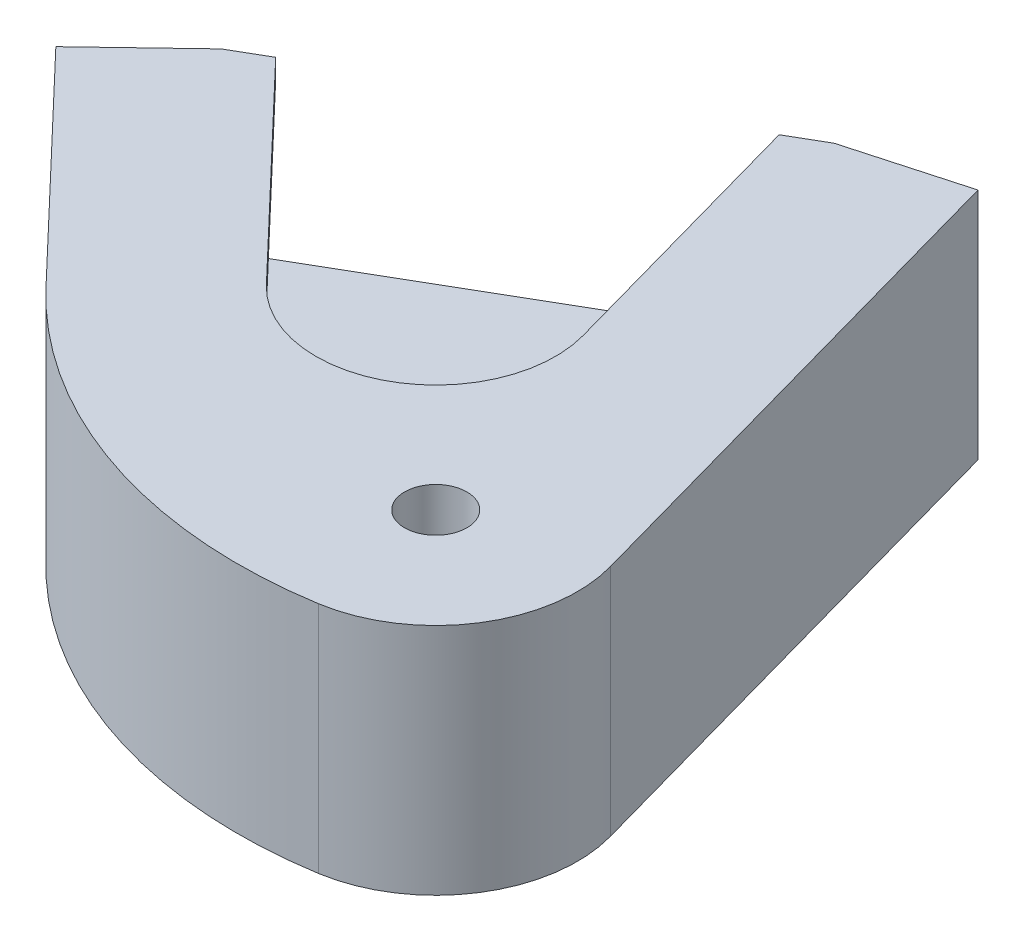
ISO-10303-21;
HEADER;
FILE_DESCRIPTION(('STEP AP214'),'2;1');
FILE_NAME('part.step','',(''),(''),'','','');
FILE_SCHEMA(('AUTOMOTIVE_DESIGN { 1 0 10303 214 1 1 1 1 }'));
ENDSEC;
DATA;
#1=APPLICATION_CONTEXT('core data for automotive mechanical design processes');
#2=APPLICATION_PROTOCOL_DEFINITION('international standard','automotive_design',2000,#1);
#3=PRODUCT_CONTEXT('',#1,'mechanical');
#4=PRODUCT('Part','Part','',(#3));
#5=PRODUCT_RELATED_PRODUCT_CATEGORY('part','',(#4));
#6=PRODUCT_DEFINITION_FORMATION('','',#4);
#7=PRODUCT_DEFINITION_CONTEXT('part definition',#1,'design');
#8=PRODUCT_DEFINITION('design','',#6,#7);
#9=PRODUCT_DEFINITION_SHAPE('','',#8);
#10=(LENGTH_UNIT() NAMED_UNIT(*) SI_UNIT(.MILLI.,.METRE.));
#11=(NAMED_UNIT(*) PLANE_ANGLE_UNIT() SI_UNIT($,.RADIAN.));
#12=(NAMED_UNIT(*) SI_UNIT($,.STERADIAN.) SOLID_ANGLE_UNIT());
#13=UNCERTAINTY_MEASURE_WITH_UNIT(LENGTH_MEASURE(1.E-05),#10,'distance_accuracy_value','');
#14=(GEOMETRIC_REPRESENTATION_CONTEXT(3) GLOBAL_UNCERTAINTY_ASSIGNED_CONTEXT((#13)) GLOBAL_UNIT_ASSIGNED_CONTEXT((#10,
#11,#12)) REPRESENTATION_CONTEXT('',''));
#15=CARTESIAN_POINT('',(0.,0.,0.));
#16=DIRECTION('',(0.,0.,1.));
#17=DIRECTION('',(1.,0.,0.));
#18=AXIS2_PLACEMENT_3D('',#15,#16,#17);
#19=CARTESIAN_POINT('',(37.5233095349054,6.,78.2478625788192));
#20=DIRECTION('',(0.690222514215804,0.,0.723597181358257));
#21=DIRECTION('',(0.723597181358257,0.,-0.690222514215804));
#22=AXIS2_PLACEMENT_3D('',#19,#20,#21);
#23=PLANE('',#22);
#24=DIRECTION('',(0.,-1.,0.));
#25=VECTOR('',#24,1.);
#26=CARTESIAN_POINT('',(41.864892623055,6.,74.1065274935243));
#27=LINE('',#26,#25);
#28=CARTESIAN_POINT('',(41.864892623055,6.00227045529371,74.1065274935243));
#29=VERTEX_POINT('',#28);
#30=CARTESIAN_POINT('',(41.864892623055,0.,74.1065274935243));
#31=VERTEX_POINT('',#30);
#32=EDGE_CURVE('E223',#29,#31,#27,.T.);
#33=ORIENTED_EDGE('',*,*,#32,.T.);
#34=DIRECTION('',(0.,1.,0.));
#35=VECTOR('',#34,1.);
#36=CARTESIAN_POINT('',(41.864892623055,-3.,74.1065274935243));
#37=LINE('',#36,#35);
#38=CARTESIAN_POINT('',(41.864892623055,-3.,74.1065274935243));
#39=VERTEX_POINT('',#38);
#40=EDGE_CURVE('E213',#39,#31,#37,.T.);
#41=ORIENTED_EDGE('',*,*,#40,.F.);
#42=DIRECTION('',(0.723597181358257,0.,-0.690222514215803));
#43=VECTOR('',#42,1.);
#44=CARTESIAN_POINT('',(37.5233095349054,-3.,78.2478625788192));
#45=LINE('',#44,#43);
#46=CARTESIAN_POINT('',(37.5233095349054,-3.,78.2478625788192));
#47=VERTEX_POINT('',#46);
#48=EDGE_CURVE('E192',#47,#39,#45,.T.);
#49=ORIENTED_EDGE('',*,*,#48,.F.);
#50=DIRECTION('',(0.,-1.,0.));
#51=VECTOR('',#50,1.);
#52=CARTESIAN_POINT('',(37.5233095349054,6.,78.2478625788192));
#53=LINE('',#52,#51);
#54=CARTESIAN_POINT('',(37.5233095349054,9.,78.2478625788192));
#55=VERTEX_POINT('',#54);
#56=EDGE_CURVE('E153',#55,#47,#53,.T.);
#57=ORIENTED_EDGE('',*,*,#56,.F.);
#58=DIRECTION('',(-0.723597181358257,0.,0.690222514215803));
#59=VECTOR('',#58,1.);
#60=CARTESIAN_POINT('',(41.864892623055,9.,74.1065274935243));
#61=LINE('',#60,#59);
#62=CARTESIAN_POINT('',(41.864892623055,9.,74.1065274935243));
#63=VERTEX_POINT('',#62);
#64=EDGE_CURVE('E147',#63,#55,#61,.T.);
#65=ORIENTED_EDGE('',*,*,#64,.F.);
#66=DIRECTION('',(0.,-1.,0.));
#67=VECTOR('',#66,1.);
#68=CARTESIAN_POINT('',(41.864892623055,9.,74.1065274935243));
#69=LINE('',#68,#67);
#70=EDGE_CURVE('E151',#63,#29,#69,.T.);
#71=ORIENTED_EDGE('',*,*,#70,.T.);
#72=EDGE_LOOP('',(#33,#41,#49,#57,#65,#71));
#73=FACE_BOUND('',#72,.T.);
#74=ADVANCED_FACE('F35',(#73),#23,.F.);
#75=CARTESIAN_POINT('',(47.9744077196013,6.,89.204307830589));
#76=DIRECTION('',(0.723597181358259,0.,-0.690222514215802));
#77=DIRECTION('',(-0.690222514215802,0.,-0.723597181358259));
#78=AXIS2_PLACEMENT_3D('',#75,#76,#77);
#79=PLANE('',#78);
#80=ORIENTED_EDGE('',*,*,#56,.T.);
#81=DIRECTION('',(-0.690222514215802,0.,-0.723597181358259));
#82=VECTOR('',#81,1.);
#83=CARTESIAN_POINT('',(47.9744077196013,-3.,89.204307830589));
#84=LINE('',#83,#82);
#85=CARTESIAN_POINT('',(47.9744077196013,-3.,89.204307830589));
#86=VERTEX_POINT('',#85);
#87=EDGE_CURVE('E189',#86,#47,#84,.T.);
#88=ORIENTED_EDGE('',*,*,#87,.F.);
#89=DIRECTION('',(0.,-1.,0.));
#90=VECTOR('',#89,1.);
#91=CARTESIAN_POINT('',(47.9744077196013,6.,89.204307830589));
#92=LINE('',#91,#90);
#93=CARTESIAN_POINT('',(47.9744077196013,9.,89.204307830589));
#94=VERTEX_POINT('',#93);
#95=EDGE_CURVE('E247',#94,#86,#92,.T.);
#96=ORIENTED_EDGE('',*,*,#95,.F.);
#97=DIRECTION('',(0.690222514215802,0.,0.723597181358259));
#98=VECTOR('',#97,1.);
#99=CARTESIAN_POINT('',(37.5233095349054,9.,78.2478625788192));
#100=LINE('',#99,#98);
#101=EDGE_CURVE('E157',#55,#94,#100,.T.);
#102=ORIENTED_EDGE('',*,*,#101,.F.);
#103=EDGE_LOOP('',(#80,#88,#96,#102));
#104=FACE_BOUND('',#103,.T.);
#105=ADVANCED_FACE('F279',(#104),#79,.F.);
#106=CARTESIAN_POINT('',(65.2230793638535,6.,72.7512013013029));
#107=DIRECTION('',(0.,-1.,0.));
#108=DIRECTION('',(0.,0.,-1.));
#109=AXIS2_PLACEMENT_3D('',#106,#107,#108);
#110=CYLINDRICAL_SURFACE('',#109,23.8373947392593);
#111=ORIENTED_EDGE('',*,*,#95,.T.);
#112=CARTESIAN_POINT('',(65.2230793638535,-3.,72.7512013013029));
#113=DIRECTION('',(0.,-1.,0.));
#114=DIRECTION('',(0.,0.,-1.));
#115=AXIS2_PLACEMENT_3D('',#112,#113,#114);
#116=CIRCLE('',#115,23.8373947392593);
#117=CARTESIAN_POINT('',(69.0510344673279,-3.,96.2792302812462));
#118=VERTEX_POINT('',#117);
#119=EDGE_CURVE('E205',#118,#86,#116,.T.);
#120=ORIENTED_EDGE('',*,*,#119,.F.);
#121=DIRECTION('',(0.,-1.,0.));
#122=VECTOR('',#121,1.);
#123=CARTESIAN_POINT('',(69.0510344673279,6.,96.2792302812462));
#124=LINE('',#123,#122);
#125=CARTESIAN_POINT('',(69.0510344673279,9.,96.2792302812462));
#126=VERTEX_POINT('',#125);
#127=EDGE_CURVE('E245',#126,#118,#124,.T.);
#128=ORIENTED_EDGE('',*,*,#127,.F.);
#129=CARTESIAN_POINT('',(65.2230793638535,9.,72.751201301303));
#130=DIRECTION('',(0.,1.,0.));
#131=DIRECTION('',(0.,0.,1.));
#132=AXIS2_PLACEMENT_3D('',#129,#130,#131);
#133=CIRCLE('',#132,23.8373947392592);
#134=EDGE_CURVE('E324',#94,#126,#133,.T.);
#135=ORIENTED_EDGE('',*,*,#134,.F.);
#136=EDGE_LOOP('',(#111,#120,#128,#135));
#137=FACE_BOUND('',#136,.T.);
#138=ADVANCED_FACE('F282',(#137),#110,.T.);
#139=CARTESIAN_POINT('',(67.8822509939086,6.,89.095454429505));
#140=DIRECTION('',(0.,-1.,0.));
#141=DIRECTION('',(0.,0.,-1.));
#142=AXIS2_PLACEMENT_3D('',#139,#140,#141);
#143=CYLINDRICAL_SURFACE('',#142,7.2782340094145);
#144=ORIENTED_EDGE('',*,*,#127,.T.);
#145=CARTESIAN_POINT('',(67.8822509939086,-3.,89.095454429505));
#146=DIRECTION('',(0.,-1.,0.));
#147=DIRECTION('',(0.,0.,-1.));
#148=AXIS2_PLACEMENT_3D('',#145,#146,#147);
#149=CIRCLE('',#148,7.27823400941449);
#150=CARTESIAN_POINT('',(74.8925955809362,-3.,87.1389884658526));
#151=VERTEX_POINT('',#150);
#152=EDGE_CURVE('E202',#151,#118,#149,.T.);
#153=ORIENTED_EDGE('',*,*,#152,.F.);
#154=DIRECTION('',(0.,-1.,0.));
#155=VECTOR('',#154,1.);
#156=CARTESIAN_POINT('',(74.8925955809362,6.,87.1389884658526));
#157=LINE('',#156,#155);
#158=CARTESIAN_POINT('',(74.8925955809362,9.,87.1389884658526));
#159=VERTEX_POINT('',#158);
#160=EDGE_CURVE('E243',#159,#151,#157,.T.);
#161=ORIENTED_EDGE('',*,*,#160,.F.);
#162=CARTESIAN_POINT('',(67.8822509939085,9.,89.0954544295049));
#163=DIRECTION('',(0.,1.,0.));
#164=DIRECTION('',(0.,0.,1.));
#165=AXIS2_PLACEMENT_3D('',#162,#163,#164);
#166=CIRCLE('',#165,7.27823400941454);
#167=EDGE_CURVE('E327',#126,#159,#166,.T.);
#168=ORIENTED_EDGE('',*,*,#167,.F.);
#169=EDGE_LOOP('',(#144,#153,#161,#168));
#170=FACE_BOUND('',#169,.T.);
#171=ADVANCED_FACE('F286',(#170),#143,.T.);
#172=CARTESIAN_POINT('',(67.5819669421436,6.,60.943784021788));
#173=DIRECTION('',(-0.963193073753831,0.,0.268810533038878));
#174=DIRECTION('',(0.268810533038878,0.,0.963193073753832));
#175=AXIS2_PLACEMENT_3D('',#172,#173,#174);
#176=PLANE('',#175);
#177=ORIENTED_EDGE('',*,*,#160,.T.);
#178=DIRECTION('',(0.268810533038878,0.,0.963193073753832));
#179=VECTOR('',#178,1.);
#180=CARTESIAN_POINT('',(67.5819669421436,-3.,60.943784021788));
#181=LINE('',#180,#179);
#182=CARTESIAN_POINT('',(67.5819669421436,-3.,60.943784021788));
#183=VERTEX_POINT('',#182);
#184=EDGE_CURVE('E199',#183,#151,#181,.T.);
#185=ORIENTED_EDGE('',*,*,#184,.F.);
#186=DIRECTION('',(0.,-1.,0.));
#187=VECTOR('',#186,1.);
#188=CARTESIAN_POINT('',(67.5819669421436,6.,60.943784021788));
#189=LINE('',#188,#187);
#190=CARTESIAN_POINT('',(67.5819669421436,9.,60.943784021788));
#191=VERTEX_POINT('',#190);
#192=EDGE_CURVE('E241',#191,#183,#189,.T.);
#193=ORIENTED_EDGE('',*,*,#192,.F.);
#194=DIRECTION('',(-0.268810533038878,0.,-0.963193073753832));
#195=VECTOR('',#194,1.);
#196=CARTESIAN_POINT('',(74.8925955809362,9.,87.1389884658526));
#197=LINE('',#196,#195);
#198=EDGE_CURVE('E330',#159,#191,#197,.T.);
#199=ORIENTED_EDGE('',*,*,#198,.F.);
#200=EDGE_LOOP('',(#177,#185,#193,#199));
#201=FACE_BOUND('',#200,.T.);
#202=ADVANCED_FACE('F290',(#201),#176,.F.);
#203=CARTESIAN_POINT('',(61.8028084996206,6.,62.5566472200212));
#204=DIRECTION('',(0.268810533038877,0.,0.963193073753832));
#205=DIRECTION('',(0.963193073753832,0.,-0.268810533038877));
#206=AXIS2_PLACEMENT_3D('',#203,#204,#205);
#207=PLANE('',#206);
#208=ORIENTED_EDGE('',*,*,#192,.T.);
#209=DIRECTION('',(0.963193073753832,0.,-0.268810533038877));
#210=VECTOR('',#209,1.);
#211=CARTESIAN_POINT('',(61.8028084996206,-3.,62.5566472200212));
#212=LINE('',#211,#210);
#213=CARTESIAN_POINT('',(61.8028084996206,-3.,62.5566472200212));
#214=VERTEX_POINT('',#213);
#215=EDGE_CURVE('E196',#214,#183,#212,.T.);
#216=ORIENTED_EDGE('',*,*,#215,.F.);
#217=DIRECTION('',(0.,1.,0.));
#218=VECTOR('',#217,1.);
#219=CARTESIAN_POINT('',(61.8028084996206,-3.,62.5566472200212));
#220=LINE('',#219,#218);
#221=CARTESIAN_POINT('',(61.8028084996206,0.,62.5566472200212));
#222=VERTEX_POINT('',#221);
#223=EDGE_CURVE('E208',#214,#222,#220,.T.);
#224=ORIENTED_EDGE('',*,*,#223,.T.);
#225=DIRECTION('',(0.,-1.,0.));
#226=VECTOR('',#225,1.);
#227=CARTESIAN_POINT('',(61.8028084996206,6.,62.5566472200212));
#228=LINE('',#227,#226);
#229=CARTESIAN_POINT('',(61.8028084996206,6.,62.5566472200212));
#230=VERTEX_POINT('',#229);
#231=EDGE_CURVE('E238',#230,#222,#228,.T.);
#232=ORIENTED_EDGE('',*,*,#231,.F.);
#233=DIRECTION('',(0.,-1.,0.));
#234=VECTOR('',#233,1.);
#235=CARTESIAN_POINT('',(61.8028084996206,9.,62.5566472200212));
#236=LINE('',#235,#234);
#237=CARTESIAN_POINT('',(61.8028084996206,9.,62.5566472200212));
#238=VERTEX_POINT('',#237);
#239=EDGE_CURVE('E174',#238,#230,#236,.T.);
#240=ORIENTED_EDGE('',*,*,#239,.F.);
#241=DIRECTION('',(-0.963193073753832,0.,0.268810533038877));
#242=VECTOR('',#241,1.);
#243=CARTESIAN_POINT('',(67.5819669421436,9.,60.943784021788));
#244=LINE('',#243,#242);
#245=EDGE_CURVE('E333',#191,#238,#244,.T.);
#246=ORIENTED_EDGE('',*,*,#245,.F.);
#247=EDGE_LOOP('',(#208,#216,#224,#232,#240,#246));
#248=FACE_BOUND('',#247,.T.);
#249=ADVANCED_FACE('F294',(#248),#207,.F.);
#250=CARTESIAN_POINT('',(65.8349664952038,6.,77.0045433263287));
#251=DIRECTION('',(0.963193073753832,0.,-0.268810533038878));
#252=DIRECTION('',(-0.268810533038878,0.,-0.963193073753832));
#253=AXIS2_PLACEMENT_3D('',#250,#251,#252);
#254=PLANE('',#253);
#255=DIRECTION('',(0.268810533038878,0.,0.963193073753832));
#256=VECTOR('',#255,1.);
#257=CARTESIAN_POINT('',(65.8349664952038,0.,77.0045433263287));
#258=LINE('',#257,#256);
#259=CARTESIAN_POINT('',(65.8349664952038,0.,77.0045433263287));
#260=VERTEX_POINT('',#259);
#261=EDGE_CURVE('E215',#222,#260,#258,.T.);
#262=ORIENTED_EDGE('',*,*,#261,.T.);
#263=DIRECTION('',(0.,-1.,0.));
#264=VECTOR('',#263,1.);
#265=CARTESIAN_POINT('',(65.8349664952038,6.,77.0045433263287));
#266=LINE('',#265,#264);
#267=CARTESIAN_POINT('',(65.8349664952038,6.,77.0045433263287));
#268=VERTEX_POINT('',#267);
#269=EDGE_CURVE('E235',#268,#260,#266,.T.);
#270=ORIENTED_EDGE('',*,*,#269,.F.);
#271=DIRECTION('',(0.268810533038878,0.,0.963193073753832));
#272=VECTOR('',#271,1.);
#273=CARTESIAN_POINT('',(65.8349664952038,6.,77.0045433263287));
#274=LINE('',#273,#272);
#275=EDGE_CURVE('E216',#230,#268,#274,.T.);
#276=ORIENTED_EDGE('',*,*,#275,.F.);
#277=ORIENTED_EDGE('',*,*,#231,.T.);
#278=EDGE_LOOP('',(#262,#270,#276,#277));
#279=FACE_BOUND('',#278,.T.);
#280=ADVANCED_FACE('F298',(#279),#254,.F.);
#281=CARTESIAN_POINT('',(57.9827560572969,6.,79.1959594928934));
#282=DIRECTION('',(0.,-1.,0.));
#283=DIRECTION('',(0.,0.,-1.));
#284=AXIS2_PLACEMENT_3D('',#281,#282,#283);
#285=CYLINDRICAL_SURFACE('',#284,8.15227045529368);
#286=CARTESIAN_POINT('',(57.9827560572969,0.,79.1959594928934));
#287=DIRECTION('',(0.,-1.,0.));
#288=DIRECTION('',(0.,0.,1.));
#289=AXIS2_PLACEMENT_3D('',#286,#287,#288);
#290=CIRCLE('',#289,8.15227045529368);
#291=CARTESIAN_POINT('',(52.218230336292,0.,84.9604852138982));
#292=VERTEX_POINT('',#291);
#293=EDGE_CURVE('E226',#260,#292,#290,.T.);
#294=ORIENTED_EDGE('',*,*,#293,.T.);
#295=DIRECTION('',(0.,-1.,0.));
#296=VECTOR('',#295,1.);
#297=CARTESIAN_POINT('',(52.218230336292,6.,84.9604852138982));
#298=LINE('',#297,#296);
#299=CARTESIAN_POINT('',(52.218230336292,6.,84.9604852138982));
#300=VERTEX_POINT('',#299);
#301=EDGE_CURVE('E232',#300,#292,#298,.T.);
#302=ORIENTED_EDGE('',*,*,#301,.F.);
#303=CARTESIAN_POINT('',(57.9827560572969,6.,79.1959594928934));
#304=DIRECTION('',(0.,-1.,0.));
#305=DIRECTION('',(0.,0.,1.));
#306=AXIS2_PLACEMENT_3D('',#303,#304,#305);
#307=CIRCLE('',#306,8.15227045529368);
#308=EDGE_CURVE('E219',#268,#300,#307,.T.);
#309=ORIENTED_EDGE('',*,*,#308,.F.);
#310=ORIENTED_EDGE('',*,*,#269,.T.);
#311=EDGE_LOOP('',(#294,#302,#309,#310));
#312=FACE_BOUND('',#311,.T.);
#313=ADVANCED_FACE('F301',(#312),#285,.F.);
#314=CARTESIAN_POINT('',(41.864892623055,6.,74.1065274935243));
#315=DIRECTION('',(-0.723597181358258,0.,0.690222514215802));
#316=DIRECTION('',(0.690222514215803,0.,0.723597181358258));
#317=AXIS2_PLACEMENT_3D('',#314,#315,#316);
#318=PLANE('',#317);
#319=DIRECTION('',(-0.690222514215802,0.,-0.723597181358258));
#320=VECTOR('',#319,1.);
#321=CARTESIAN_POINT('',(41.864892623055,0.,74.1065274935243));
#322=LINE('',#321,#320);
#323=EDGE_CURVE('E220',#292,#31,#322,.T.);
#324=ORIENTED_EDGE('',*,*,#323,.T.);
#325=ORIENTED_EDGE('',*,*,#32,.F.);
#326=DIRECTION('',(-0.690222514215802,0.,-0.723597181358258));
#327=VECTOR('',#326,1.);
#328=CARTESIAN_POINT('',(41.864892623055,6.00227045529372,74.1065274935243));
#329=LINE('',#328,#327);
#330=CARTESIAN_POINT('',(52.0854390292271,6.00227045529372,84.8212729837521));
#331=VERTEX_POINT('',#330);
#332=EDGE_CURVE('E44',#29,#331,#329,.F.);
#333=ORIENTED_EDGE('',*,*,#332,.T.);
#334=CARTESIAN_POINT('',(52.0854390292271,6.00227045529372,84.8212729837521));
#335=CARTESIAN_POINT('',(52.1075739954533,6.00227036307175,84.8444782528369));
#336=CARTESIAN_POINT('',(52.1297074208754,6.00208111235113,84.8676819066143));
#337=CARTESIAN_POINT('',(52.173971189897,6.00132429391623,84.9140859833296));
#338=CARTESIAN_POINT('',(52.1961015334965,6.00075672620563,84.9372864062675));
#339=CARTESIAN_POINT('',(52.218230336292,6.00000000000003,84.9604852138982));
#340=B_SPLINE_CURVE_WITH_KNOTS('',3,(#334,#335,#336,#337,#338,#339),.UNSPECIFIED.,.F.,.F.,(4,2,
4),(0.,0.0962029363812373,0.192405871829883),.UNSPECIFIED.);
#341=EDGE_CURVE('E11',#331,#300,#340,.T.);
#342=ORIENTED_EDGE('',*,*,#341,.T.);
#343=ORIENTED_EDGE('',*,*,#301,.T.);
#344=EDGE_LOOP('',(#324,#325,#333,#342,#343));
#345=FACE_BOUND('',#344,.T.);
#346=ADVANCED_FACE('F264',(#345),#318,.F.);
#347=CARTESIAN_POINT('',(67.8822509939086,6.,89.095454429505));
#348=DIRECTION('',(0.,-1.,0.));
#349=DIRECTION('',(0.,0.,-1.));
#350=AXIS2_PLACEMENT_3D('',#347,#348,#349);
#351=CYLINDRICAL_SURFACE('',#350,1.60000000000001);
#352=CARTESIAN_POINT('',(67.8822509939086,-3.,89.095454429505));
#353=DIRECTION('',(0.,-1.,0.));
#354=DIRECTION('',(0.,0.,-1.));
#355=AXIS2_PLACEMENT_3D('',#352,#353,#354);
#356=CIRCLE('',#355,1.59999999999998);
#357=CARTESIAN_POINT('',(67.8822509939086,-3.,87.495454429505));
#358=VERTEX_POINT('',#357);
#359=EDGE_CURVE('E184',#358,#358,#356,.T.);
#360=ORIENTED_EDGE('',*,*,#359,.T.);
#361=EDGE_LOOP('',(#360));
#362=FACE_BOUND('',#361,.T.);
#363=CARTESIAN_POINT('',(67.8822509939085,9.,89.0954544295049));
#364=DIRECTION('',(0.,1.,0.));
#365=DIRECTION('',(0.,0.,1.));
#366=AXIS2_PLACEMENT_3D('',#363,#364,#365);
#367=CIRCLE('',#366,1.60000000000006);
#368=CARTESIAN_POINT('',(67.8822509939085,9.,90.695454429505));
#369=VERTEX_POINT('',#368);
#370=EDGE_CURVE('E168',#369,#369,#367,.T.);
#371=ORIENTED_EDGE('',*,*,#370,.T.);
#372=EDGE_LOOP('',(#371));
#373=FACE_BOUND('',#372,.T.);
#374=ADVANCED_FACE('F308',(#362,#373),#351,.F.);
#375=CARTESIAN_POINT('',(67.8822509939086,-3.,89.095454429505));
#376=DIRECTION('',(0.,-1.,0.));
#377=DIRECTION('',(0.,0.,-1.));
#378=AXIS2_PLACEMENT_3D('',#375,#376,#377);
#379=PLANE('',#378);
#380=ORIENTED_EDGE('',*,*,#359,.F.);
#381=EDGE_LOOP('',(#380));
#382=FACE_BOUND('',#381,.T.);
#383=ORIENTED_EDGE('',*,*,#87,.T.);
#384=ORIENTED_EDGE('',*,*,#48,.T.);
#385=DIRECTION('',(0.865296854236259,0.,-0.501259767035849));
#386=VECTOR('',#385,1.);
#387=CARTESIAN_POINT('',(41.864892623055,-3.,74.1065274935243));
#388=LINE('',#387,#386);
#389=EDGE_CURVE('E194',#39,#214,#388,.T.);
#390=ORIENTED_EDGE('',*,*,#389,.T.);
#391=ORIENTED_EDGE('',*,*,#215,.T.);
#392=ORIENTED_EDGE('',*,*,#184,.T.);
#393=ORIENTED_EDGE('',*,*,#152,.T.);
#394=ORIENTED_EDGE('',*,*,#119,.T.);
#395=EDGE_LOOP('',(#383,#384,#390,#391,#392,#393,#394));
#396=FACE_BOUND('',#395,.T.);
#397=CARTESIAN_POINT('',(57.9827560572969,-3.,79.1959594928934));
#398=DIRECTION('',(0.,-1.,0.));
#399=DIRECTION('',(0.,0.,-1.));
#400=AXIS2_PLACEMENT_3D('',#397,#398,#399);
#401=CIRCLE('',#400,1.6);
#402=CARTESIAN_POINT('',(57.9827560572969,-3.,77.5959594928933));
#403=VERTEX_POINT('',#402);
#404=EDGE_CURVE('E177',#403,#403,#401,.T.);
#405=ORIENTED_EDGE('',*,*,#404,.F.);
#406=EDGE_LOOP('',(#405));
#407=FACE_BOUND('',#406,.T.);
#408=ADVANCED_FACE('F384',(#382,#396,#407),#379,.T.);
#409=CARTESIAN_POINT('',(67.8822509939086,0.,89.095454429505));
#410=DIRECTION('',(0.,-1.,0.));
#411=DIRECTION('',(0.,0.,-1.));
#412=AXIS2_PLACEMENT_3D('',#409,#410,#411);
#413=PLANE('',#412);
#414=ORIENTED_EDGE('',*,*,#323,.F.);
#415=ORIENTED_EDGE('',*,*,#293,.F.);
#416=ORIENTED_EDGE('',*,*,#261,.F.);
#417=DIRECTION('',(0.865296854236259,0.,-0.501259767035849));
#418=VECTOR('',#417,1.);
#419=CARTESIAN_POINT('',(41.864892623055,0.,74.1065274935243));
#420=LINE('',#419,#418);
#421=EDGE_CURVE('E188',#31,#222,#420,.T.);
#422=ORIENTED_EDGE('',*,*,#421,.F.);
#423=EDGE_LOOP('',(#414,#415,#416,#422));
#424=FACE_BOUND('',#423,.T.);
#425=CARTESIAN_POINT('',(57.9827560572969,0.,79.1959594928934));
#426=DIRECTION('',(0.,-1.,0.));
#427=DIRECTION('',(0.,0.,-1.));
#428=AXIS2_PLACEMENT_3D('',#425,#426,#427);
#429=CIRCLE('',#428,1.6);
#430=CARTESIAN_POINT('',(57.9827560572969,0.,77.5959594928933));
#431=VERTEX_POINT('',#430);
#432=EDGE_CURVE('E173',#431,#431,#429,.T.);
#433=ORIENTED_EDGE('',*,*,#432,.T.);
#434=EDGE_LOOP('',(#433));
#435=FACE_BOUND('',#434,.T.);
#436=ADVANCED_FACE('F387',(#424,#435),#413,.F.);
#437=CARTESIAN_POINT('',(41.864892623055,-3.,74.1065274935243));
#438=DIRECTION('',(0.501259767035849,0.,0.865296854236259));
#439=DIRECTION('',(0.865296854236259,0.,-0.501259767035849));
#440=AXIS2_PLACEMENT_3D('',#437,#438,#439);
#441=PLANE('',#440);
#442=ORIENTED_EDGE('',*,*,#421,.T.);
#443=ORIENTED_EDGE('',*,*,#223,.F.);
#444=ORIENTED_EDGE('',*,*,#389,.F.);
#445=ORIENTED_EDGE('',*,*,#40,.T.);
#446=EDGE_LOOP('',(#442,#443,#444,#445));
#447=FACE_BOUND('',#446,.T.);
#448=ADVANCED_FACE('F382',(#447),#441,.F.);
#449=CARTESIAN_POINT('',(57.9827560572969,-3.,79.1959594928934));
#450=DIRECTION('',(0.,1.,0.));
#451=DIRECTION('',(0.,0.,1.));
#452=AXIS2_PLACEMENT_3D('',#449,#450,#451);
#453=CYLINDRICAL_SURFACE('',#452,1.6);
#454=ORIENTED_EDGE('',*,*,#404,.T.);
#455=EDGE_LOOP('',(#454));
#456=FACE_BOUND('',#455,.T.);
#457=ORIENTED_EDGE('',*,*,#432,.F.);
#458=EDGE_LOOP('',(#457));
#459=FACE_BOUND('',#458,.T.);
#460=ADVANCED_FACE('F379',(#456,#459),#453,.F.);
#461=CARTESIAN_POINT('',(65.2230793638535,9.,72.751201301303));
#462=DIRECTION('',(0.,1.,0.));
#463=DIRECTION('',(0.,0.,1.));
#464=AXIS2_PLACEMENT_3D('',#461,#462,#463);
#465=PLANE('',#464);
#466=DIRECTION('',(-0.865296854236261,0.,0.501259767035846));
#467=VECTOR('',#466,1.);
#468=CARTESIAN_POINT('',(43.6431216031287,9.,73.0764132154886));
#469=LINE('',#468,#467);
#470=CARTESIAN_POINT('',(43.6431216031287,9.,73.0764132154886));
#471=VERTEX_POINT('',#470);
#472=EDGE_CURVE('E158',#471,#63,#469,.T.);
#473=ORIENTED_EDGE('',*,*,#472,.T.);
#474=ORIENTED_EDGE('',*,*,#64,.T.);
#475=ORIENTED_EDGE('',*,*,#101,.T.);
#476=ORIENTED_EDGE('',*,*,#134,.T.);
#477=ORIENTED_EDGE('',*,*,#167,.T.);
#478=ORIENTED_EDGE('',*,*,#198,.T.);
#479=ORIENTED_EDGE('',*,*,#245,.T.);
#480=DIRECTION('',(-0.865296854236261,0.,0.501259767035845));
#481=VECTOR('',#480,1.);
#482=CARTESIAN_POINT('',(61.8028084996206,9.,62.5566472200212));
#483=LINE('',#482,#481);
#484=CARTESIAN_POINT('',(60.0153593252298,9.,63.5921026852262));
#485=VERTEX_POINT('',#484);
#486=EDGE_CURVE('E335',#238,#485,#483,.T.);
#487=ORIENTED_EDGE('',*,*,#486,.T.);
#488=DIRECTION('',(0.268810533038877,0.,0.963193073753832));
#489=VECTOR('',#488,1.);
#490=CARTESIAN_POINT('',(60.0153593252298,9.,63.5921026852262));
#491=LINE('',#490,#489);
#492=CARTESIAN_POINT('',(63.9085803476961,9.,77.5421643924065));
#493=VERTEX_POINT('',#492);
#494=EDGE_CURVE('E337',#485,#493,#491,.T.);
#495=ORIENTED_EDGE('',*,*,#494,.T.);
#496=CARTESIAN_POINT('',(57.9827560572969,9.,79.1959594928934));
#497=DIRECTION('',(0.,-1.,0.));
#498=DIRECTION('',(0.,0.,-1.));
#499=AXIS2_PLACEMENT_3D('',#496,#497,#498);
#500=CIRCLE('',#499,6.15227045529368);
#501=CARTESIAN_POINT('',(53.5309904968927,9.,83.4423950746818));
#502=VERTEX_POINT('',#501);
#503=EDGE_CURVE('E339',#493,#502,#500,.T.);
#504=ORIENTED_EDGE('',*,*,#503,.T.);
#505=DIRECTION('',(-0.690222514215803,0.,-0.723597181358258));
#506=VECTOR('',#505,1.);
#507=CARTESIAN_POINT('',(53.5309904968927,9.,83.4423950746818));
#508=LINE('',#507,#506);
#509=EDGE_CURVE('E164',#502,#471,#508,.T.);
#510=ORIENTED_EDGE('',*,*,#509,.T.);
#511=EDGE_LOOP('',(#473,#474,#475,#476,#477,#478,#479,#487,#495,#504,#510));
#512=FACE_BOUND('',#511,.T.);
#513=ORIENTED_EDGE('',*,*,#370,.F.);
#514=EDGE_LOOP('',(#513));
#515=FACE_BOUND('',#514,.T.);
#516=ADVANCED_FACE('F161',(#512,#515),#465,.T.);
#517=CARTESIAN_POINT('',(43.6431216031287,9.,73.0764132154886));
#518=DIRECTION('',(0.501259767035846,0.,0.865296854236261));
#519=DIRECTION('',(0.865296854236261,0.,-0.501259767035846));
#520=AXIS2_PLACEMENT_3D('',#517,#518,#519);
#521=PLANE('',#520);
#522=DIRECTION('',(0.,-1.,0.));
#523=VECTOR('',#522,1.);
#524=CARTESIAN_POINT('',(43.6431216031287,9.,73.0764132154886));
#525=LINE('',#524,#523);
#526=CARTESIAN_POINT('',(43.6431216031287,8.00000000000001,73.0764132154886));
#527=VERTEX_POINT('',#526);
#528=EDGE_CURVE('E342',#471,#527,#525,.T.);
#529=ORIENTED_EDGE('',*,*,#528,.T.);
#530=DIRECTION('',(0.620449133391367,0.697035971549607,-0.359421378384477));
#531=VECTOR('',#530,1.);
#532=CARTESIAN_POINT('',(45.1378854420272,9.6792741074338,72.2105080986589));
#533=LINE('',#532,#531);
#534=EDGE_CURVE('E172',#527,#29,#533,.F.);
#535=ORIENTED_EDGE('',*,*,#534,.T.);
#536=ORIENTED_EDGE('',*,*,#70,.F.);
#537=ORIENTED_EDGE('',*,*,#472,.F.);
#538=EDGE_LOOP('',(#529,#535,#536,#537));
#539=FACE_BOUND('',#538,.T.);
#540=ADVANCED_FACE('F171',(#539),#521,.F.);
#541=CARTESIAN_POINT('',(61.8028084996206,9.,62.5566472200212));
#542=DIRECTION('',(0.501259767035846,0.,0.865296854236261));
#543=DIRECTION('',(0.865296854236261,0.,-0.501259767035846));
#544=AXIS2_PLACEMENT_3D('',#541,#542,#543);
#545=PLANE('',#544);
#546=ORIENTED_EDGE('',*,*,#239,.T.);
#547=DIRECTION('',(0.621664385688992,-0.695588321722054,-0.360125364629908));
#548=VECTOR('',#547,1.);
#549=CARTESIAN_POINT('',(60.0153593252298,8.00000000000001,63.5921026852262));
#550=LINE('',#549,#548);
#551=CARTESIAN_POINT('',(60.0153593252298,8.00000000000001,63.5921026852262));
#552=VERTEX_POINT('',#551);
#553=EDGE_CURVE('E58',#230,#552,#550,.F.);
#554=ORIENTED_EDGE('',*,*,#553,.T.);
#555=DIRECTION('',(0.,-1.,0.));
#556=VECTOR('',#555,1.);
#557=CARTESIAN_POINT('',(60.0153593252298,9.,63.5921026852262));
#558=LINE('',#557,#556);
#559=EDGE_CURVE('E179',#485,#552,#558,.T.);
#560=ORIENTED_EDGE('',*,*,#559,.F.);
#561=ORIENTED_EDGE('',*,*,#486,.F.);
#562=EDGE_LOOP('',(#546,#554,#560,#561));
#563=FACE_BOUND('',#562,.T.);
#564=ADVANCED_FACE('F374',(#563),#545,.F.);
#565=CARTESIAN_POINT('',(60.0153593252298,9.,63.5921026852262));
#566=DIRECTION('',(0.963193073753832,0.,-0.268810533038877));
#567=DIRECTION('',(-0.268810533038877,0.,-0.963193073753832));
#568=AXIS2_PLACEMENT_3D('',#565,#566,#567);
#569=PLANE('',#568);
#570=ORIENTED_EDGE('',*,*,#559,.T.);
#571=DIRECTION('',(0.268810533038877,0.,0.963193073753832));
#572=VECTOR('',#571,1.);
#573=CARTESIAN_POINT('',(60.0153593252298,8.00000000000001,63.5921026852262));
#574=LINE('',#573,#572);
#575=CARTESIAN_POINT('',(63.9085803476961,8.00000000000001,77.5421643924065));
#576=VERTEX_POINT('',#575);
#577=EDGE_CURVE('E256',#552,#576,#574,.T.);
#578=ORIENTED_EDGE('',*,*,#577,.T.);
#579=DIRECTION('',(0.,-1.,0.));
#580=VECTOR('',#579,1.);
#581=CARTESIAN_POINT('',(63.9085803476961,9.,77.5421643924065));
#582=LINE('',#581,#580);
#583=EDGE_CURVE('E347',#493,#576,#582,.T.);
#584=ORIENTED_EDGE('',*,*,#583,.F.);
#585=ORIENTED_EDGE('',*,*,#494,.F.);
#586=EDGE_LOOP('',(#570,#578,#584,#585));
#587=FACE_BOUND('',#586,.T.);
#588=ADVANCED_FACE('F352',(#587),#569,.F.);
#589=CARTESIAN_POINT('',(57.9827560572969,9.,79.1959594928934));
#590=DIRECTION('',(0.,-1.,0.));
#591=DIRECTION('',(0.,0.,-1.));
#592=AXIS2_PLACEMENT_3D('',#589,#590,#591);
#593=CYLINDRICAL_SURFACE('',#592,6.15227045529368);
#594=ORIENTED_EDGE('',*,*,#583,.T.);
#595=CARTESIAN_POINT('',(57.9827560572969,8.00000000000001,79.1959594928934));
#596=DIRECTION('',(0.,1.,0.));
#597=DIRECTION('',(0.,0.,1.));
#598=AXIS2_PLACEMENT_3D('',#595,#596,#597);
#599=CIRCLE('',#598,6.15227045529368);
#600=CARTESIAN_POINT('',(53.5309904968927,8.00000000000001,83.4423950746818));
#601=VERTEX_POINT('',#600);
#602=EDGE_CURVE('E254',#576,#601,#599,.F.);
#603=ORIENTED_EDGE('',*,*,#602,.T.);
#604=DIRECTION('',(0.,-1.,0.));
#605=VECTOR('',#604,1.);
#606=CARTESIAN_POINT('',(53.5309904968927,9.,83.4423950746818));
#607=LINE('',#606,#605);
#608=EDGE_CURVE('E344',#502,#601,#607,.T.);
#609=ORIENTED_EDGE('',*,*,#608,.F.);
#610=ORIENTED_EDGE('',*,*,#503,.F.);
#611=EDGE_LOOP('',(#594,#603,#609,#610));
#612=FACE_BOUND('',#611,.T.);
#613=ADVANCED_FACE('F359',(#612),#593,.F.);
#614=CARTESIAN_POINT('',(53.5309904968927,9.,83.4423950746818));
#615=DIRECTION('',(-0.723597181358258,0.,0.690222514215802));
#616=DIRECTION('',(0.690222514215803,0.,0.723597181358258));
#617=AXIS2_PLACEMENT_3D('',#614,#615,#616);
#618=PLANE('',#617);
#619=ORIENTED_EDGE('',*,*,#608,.T.);
#620=DIRECTION('',(-0.690222514215803,0.,-0.723597181358258));
#621=VECTOR('',#620,1.);
#622=CARTESIAN_POINT('',(53.5309904968927,8.00000000000001,83.4423950746818));
#623=LINE('',#622,#621);
#624=EDGE_CURVE('E250',#601,#527,#623,.T.);
#625=ORIENTED_EDGE('',*,*,#624,.T.);
#626=ORIENTED_EDGE('',*,*,#528,.F.);
#627=ORIENTED_EDGE('',*,*,#509,.F.);
#628=EDGE_LOOP('',(#619,#625,#626,#627));
#629=FACE_BOUND('',#628,.T.);
#630=ADVANCED_FACE('F362',(#629),#618,.F.);
#631=CARTESIAN_POINT('',(60.0153593252298,8.00000000000001,63.5921026852262));
#632=DIRECTION('',(0.681080354043249,0.707106781186547,-0.19007775076616));
#633=DIRECTION('',(0.268810533038877,0.,0.963193073753832));
#634=AXIS2_PLACEMENT_3D('',#631,#632,#633);
#635=PLANE('',#634);
#636=ORIENTED_EDGE('',*,*,#553,.F.);
#637=ORIENTED_EDGE('',*,*,#275,.T.);
#638=DIRECTION('',(0.68108035404325,-0.707106781186547,-0.19007775076616));
#639=VECTOR('',#638,1.);
#640=CARTESIAN_POINT('',(63.9085803476961,8.00000000000001,77.5421643924065));
#641=LINE('',#640,#639);
#642=EDGE_CURVE('E39',#576,#268,#641,.T.);
#643=ORIENTED_EDGE('',*,*,#642,.F.);
#644=ORIENTED_EDGE('',*,*,#577,.F.);
#645=EDGE_LOOP('',(#636,#637,#643,#644));
#646=FACE_BOUND('',#645,.T.);
#647=ADVANCED_FACE('F37',(#646),#635,.F.);
#648=CARTESIAN_POINT('',(57.9827560572969,8.00000000000001,79.1959594928934));
#649=DIRECTION('',(0.,-1.,0.));
#650=DIRECTION('',(0.,0.,-1.));
#651=AXIS2_PLACEMENT_3D('',#648,#649,#650);
#652=CONICAL_SURFACE('',#651,6.15227045529368,0.78539816339745);
#653=DIRECTION('',(-0.511660473785898,-0.707106781186547,0.488061020329622));
#654=VECTOR('',#653,1.);
#655=CARTESIAN_POINT('',(53.5309904968927,8.00000000000001,83.4423950746818));
#656=LINE('',#655,#654);
#657=EDGE_CURVE('E263',#601,#331,#656,.T.);
#658=ORIENTED_EDGE('',*,*,#657,.F.);
#659=ORIENTED_EDGE('',*,*,#602,.F.);
#660=ORIENTED_EDGE('',*,*,#642,.T.);
#661=ORIENTED_EDGE('',*,*,#308,.T.);
#662=ORIENTED_EDGE('',*,*,#341,.F.);
#663=EDGE_LOOP('',(#658,#659,#660,#661,#662));
#664=FACE_BOUND('',#663,.T.);
#665=ADVANCED_FACE('F268',(#664),#652,.F.);
#666=CARTESIAN_POINT('',(53.5309904968927,8.00000000000001,83.4423950746818));
#667=DIRECTION('',(-0.511660473785895,0.707106781186549,0.488061020329621));
#668=DIRECTION('',(-0.690222514215803,0.,-0.723597181358258));
#669=AXIS2_PLACEMENT_3D('',#666,#667,#668);
#670=PLANE('',#669);
#671=ORIENTED_EDGE('',*,*,#624,.F.);
#672=ORIENTED_EDGE('',*,*,#657,.T.);
#673=ORIENTED_EDGE('',*,*,#332,.F.);
#674=ORIENTED_EDGE('',*,*,#534,.F.);
#675=EDGE_LOOP('',(#671,#672,#673,#674));
#676=FACE_BOUND('',#675,.T.);
#677=ADVANCED_FACE('F272',(#676),#670,.F.);
#678=CLOSED_SHELL('',(#74,#105,#138,#171,#202,#249,#280,#313,#346,#374,#408,#436,#448,#460,#516,
#540,#564,#588,#613,#630,#647,#665,#677));
#679=MANIFOLD_SOLID_BREP('B2',#678);
#680=ADVANCED_BREP_SHAPE_REPRESENTATION('',(#18,#679),#14);
#681=SHAPE_DEFINITION_REPRESENTATION(#9,#680);
ENDSEC;
END-ISO-10303-21;
